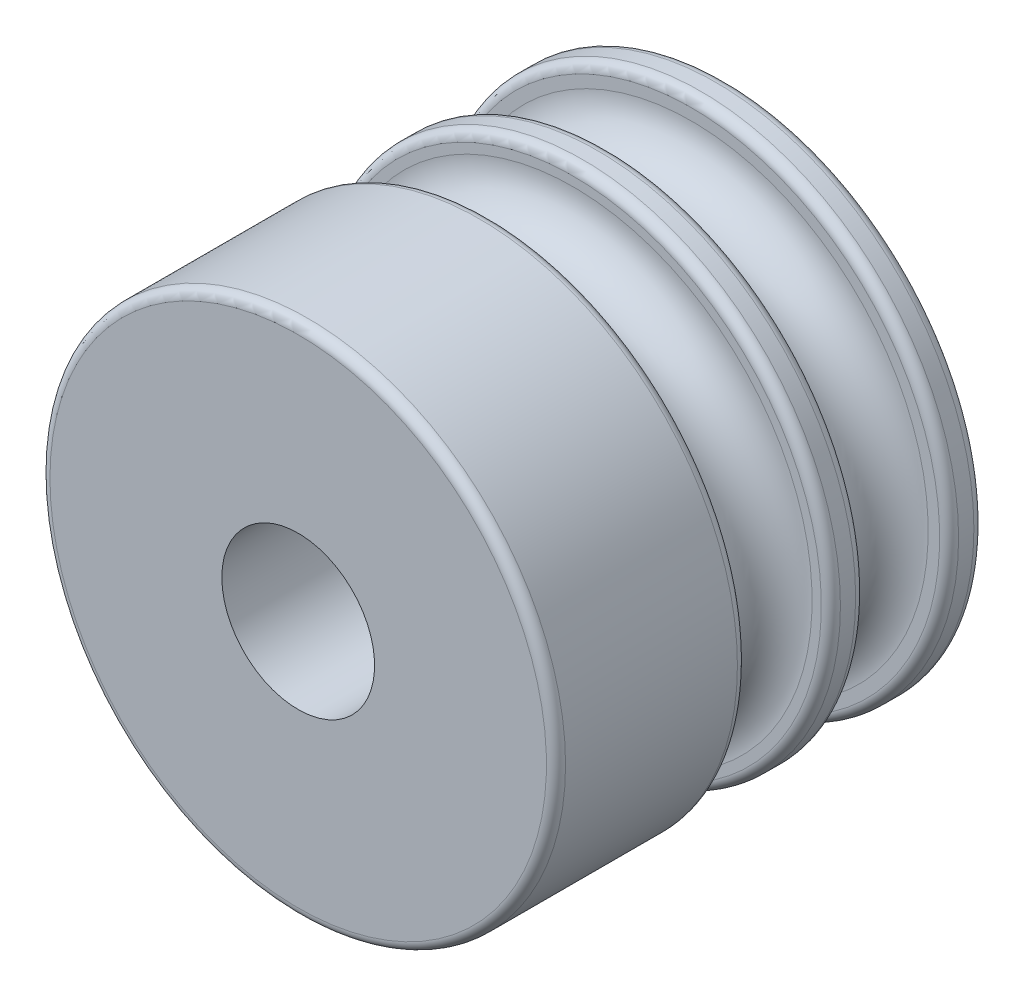
ISO-10303-21;
HEADER;
FILE_DESCRIPTION(('STEP AP214'),'2;1');
FILE_NAME('part.step','',(''),(''),'','','');
FILE_SCHEMA(('AUTOMOTIVE_DESIGN { 1 0 10303 214 1 1 1 1 }'));
ENDSEC;
DATA;
#1=APPLICATION_CONTEXT('core data for automotive mechanical design processes');
#2=APPLICATION_PROTOCOL_DEFINITION('international standard','automotive_design',2000,#1);
#3=PRODUCT_CONTEXT('',#1,'mechanical');
#4=PRODUCT('Part','Part','',(#3));
#5=PRODUCT_RELATED_PRODUCT_CATEGORY('part','',(#4));
#6=PRODUCT_DEFINITION_FORMATION('','',#4);
#7=PRODUCT_DEFINITION_CONTEXT('part definition',#1,'design');
#8=PRODUCT_DEFINITION('design','',#6,#7);
#9=PRODUCT_DEFINITION_SHAPE('','',#8);
#10=(LENGTH_UNIT() NAMED_UNIT(*) SI_UNIT(.MILLI.,.METRE.));
#11=(NAMED_UNIT(*) PLANE_ANGLE_UNIT() SI_UNIT($,.RADIAN.));
#12=(NAMED_UNIT(*) SI_UNIT($,.STERADIAN.) SOLID_ANGLE_UNIT());
#13=UNCERTAINTY_MEASURE_WITH_UNIT(LENGTH_MEASURE(1.E-05),#10,'distance_accuracy_value','');
#14=(GEOMETRIC_REPRESENTATION_CONTEXT(3) GLOBAL_UNCERTAINTY_ASSIGNED_CONTEXT((#13)) GLOBAL_UNIT_ASSIGNED_CONTEXT((#10,
#11,#12)) REPRESENTATION_CONTEXT('',''));
#15=CARTESIAN_POINT('',(0.,0.,0.));
#16=DIRECTION('',(0.,0.,1.));
#17=DIRECTION('',(1.,0.,0.));
#18=AXIS2_PLACEMENT_3D('',#15,#16,#17);
#19=CARTESIAN_POINT('',(-56.5563014577714,0.,-14.6506404312074));
#20=DIRECTION('',(0.,0.,-1.));
#21=DIRECTION('',(-1.,0.,0.));
#22=AXIS2_PLACEMENT_3D('',#19,#20,#21);
#23=TOROIDAL_SURFACE('',#22,12.4003010713163,2.2);
#24=CARTESIAN_POINT('',(-56.5563014577714,0.,-16.8475472081048));
#25=DIRECTION('',(0.,0.,-1.));
#26=DIRECTION('',(-1.,0.,0.));
#27=AXIS2_PLACEMENT_3D('',#24,#25,#26);
#28=CIRCLE('',#27,12.5169227400667);
#29=CARTESIAN_POINT('',(-69.0732241978381,0.,-16.8475472081048));
#30=VERTEX_POINT('',#29);
#31=EDGE_CURVE('E10',#30,#30,#28,.T.);
#32=ORIENTED_EDGE('',*,*,#31,.F.);
#33=EDGE_LOOP('',(#32));
#34=FACE_BOUND('',#33,.T.);
#35=CARTESIAN_POINT('',(-56.5563014577714,0.,-12.4531341862328));
#36=DIRECTION('',(0.,0.,-1.));
#37=DIRECTION('',(-1.,0.,0.));
#38=AXIS2_PLACEMENT_3D('',#35,#36,#37);
#39=CIRCLE('',#38,12.5050211901936);
#40=CARTESIAN_POINT('',(-69.0613226479649,0.,-12.4531341862328));
#41=VERTEX_POINT('',#40);
#42=EDGE_CURVE('E85',#41,#41,#39,.T.);
#43=ORIENTED_EDGE('',*,*,#42,.T.);
#44=EDGE_LOOP('',(#43));
#45=FACE_BOUND('',#44,.T.);
#46=ADVANCED_FACE('F27',(#34,#45),#23,.F.);
#47=CARTESIAN_POINT('',(-44.0393787177046,0.,-16.8475472081048));
#48=DIRECTION('',(0.,0.,-1.));
#49=DIRECTION('',(-1.,0.,0.));
#50=AXIS2_PLACEMENT_3D('',#47,#48,#49);
#51=PLANE('',#50);
#52=CARTESIAN_POINT('',(-56.5563014577714,0.,-16.8475472081048));
#53=DIRECTION('',(0.,0.,-1.));
#54=DIRECTION('',(-1.,0.,0.));
#55=AXIS2_PLACEMENT_3D('',#52,#53,#54);
#56=CIRCLE('',#55,13.);
#57=CARTESIAN_POINT('',(-69.5563014577714,0.,-16.8475472081048));
#58=VERTEX_POINT('',#57);
#59=EDGE_CURVE('E33',#58,#58,#56,.T.);
#60=ORIENTED_EDGE('',*,*,#59,.F.);
#61=EDGE_LOOP('',(#60));
#62=FACE_BOUND('',#61,.T.);
#63=ORIENTED_EDGE('',*,*,#31,.T.);
#64=EDGE_LOOP('',(#63));
#65=FACE_BOUND('',#64,.T.);
#66=ADVANCED_FACE('F182',(#62,#65),#51,.F.);
#67=CARTESIAN_POINT('',(-56.5563014577714,0.,-17.3475472081048));
#68=DIRECTION('',(0.,0.,-1.));
#69=DIRECTION('',(-1.,0.,0.));
#70=AXIS2_PLACEMENT_3D('',#67,#68,#69);
#71=TOROIDAL_SURFACE('',#70,13.,0.5);
#72=CARTESIAN_POINT('',(-56.5563014577714,0.,-17.3475472081048));
#73=DIRECTION('',(0.,0.,-1.));
#74=DIRECTION('',(-1.,0.,0.));
#75=AXIS2_PLACEMENT_3D('',#72,#73,#74);
#76=CIRCLE('',#75,13.5);
#77=CARTESIAN_POINT('',(-70.0563014577714,0.,-17.3475472081048));
#78=VERTEX_POINT('',#77);
#79=EDGE_CURVE('E37',#78,#78,#76,.T.);
#80=ORIENTED_EDGE('',*,*,#79,.F.);
#81=EDGE_LOOP('',(#80));
#82=FACE_BOUND('',#81,.T.);
#83=ORIENTED_EDGE('',*,*,#59,.T.);
#84=EDGE_LOOP('',(#83));
#85=FACE_BOUND('',#84,.T.);
#86=ADVANCED_FACE('F177',(#82,#85),#71,.T.);
#87=CARTESIAN_POINT('',(-56.5563014577714,0.,-55.2783424319312));
#88=DIRECTION('',(0.,0.,-1.));
#89=DIRECTION('',(-1.,0.,0.));
#90=AXIS2_PLACEMENT_3D('',#87,#88,#89);
#91=CYLINDRICAL_SURFACE('',#90,13.5);
#92=CARTESIAN_POINT('',(-56.5563014577714,0.,-18.1437652868408));
#93=DIRECTION('',(0.,0.,-1.));
#94=DIRECTION('',(-1.,0.,0.));
#95=AXIS2_PLACEMENT_3D('',#92,#93,#94);
#96=CIRCLE('',#95,13.5);
#97=CARTESIAN_POINT('',(-70.0563014577714,0.,-18.1437652868408));
#98=VERTEX_POINT('',#97);
#99=EDGE_CURVE('E41',#98,#98,#96,.T.);
#100=ORIENTED_EDGE('',*,*,#99,.F.);
#101=EDGE_LOOP('',(#100));
#102=FACE_BOUND('',#101,.T.);
#103=ORIENTED_EDGE('',*,*,#79,.T.);
#104=EDGE_LOOP('',(#103));
#105=FACE_BOUND('',#104,.T.);
#106=ADVANCED_FACE('F171',(#102,#105),#91,.T.);
#107=CARTESIAN_POINT('',(-56.5563014577714,0.,-18.1437652868408));
#108=DIRECTION('',(0.,0.,-1.));
#109=DIRECTION('',(-1.,0.,0.));
#110=AXIS2_PLACEMENT_3D('',#107,#108,#109);
#111=TOROIDAL_SURFACE('',#110,13.,0.5);
#112=CARTESIAN_POINT('',(-56.5563014577714,0.,-18.6437652868408));
#113=DIRECTION('',(0.,0.,-1.));
#114=DIRECTION('',(-1.,0.,0.));
#115=AXIS2_PLACEMENT_3D('',#112,#113,#114);
#116=CIRCLE('',#115,13.);
#117=CARTESIAN_POINT('',(-69.5563014577714,0.,-18.6437652868408));
#118=VERTEX_POINT('',#117);
#119=EDGE_CURVE('E46',#118,#118,#116,.T.);
#120=ORIENTED_EDGE('',*,*,#119,.F.);
#121=EDGE_LOOP('',(#120));
#122=FACE_BOUND('',#121,.T.);
#123=ORIENTED_EDGE('',*,*,#99,.T.);
#124=EDGE_LOOP('',(#123));
#125=FACE_BOUND('',#124,.T.);
#126=ADVANCED_FACE('F165',(#122,#125),#111,.T.);
#127=CARTESIAN_POINT('',(-44.156000386455,0.,-18.6437652868408));
#128=DIRECTION('',(0.,0.,1.));
#129=DIRECTION('',(1.,0.,0.));
#130=AXIS2_PLACEMENT_3D('',#127,#128,#129);
#131=PLANE('',#130);
#132=CARTESIAN_POINT('',(-56.5563014577714,0.,-18.6437652868408));
#133=DIRECTION('',(0.,0.,-1.));
#134=DIRECTION('',(-1.,0.,0.));
#135=AXIS2_PLACEMENT_3D('',#132,#133,#134);
#136=CIRCLE('',#135,12.4003010713163);
#137=CARTESIAN_POINT('',(-68.9566025290877,0.,-18.6437652868408));
#138=VERTEX_POINT('',#137);
#139=EDGE_CURVE('E49',#138,#138,#136,.T.);
#140=ORIENTED_EDGE('',*,*,#139,.F.);
#141=EDGE_LOOP('',(#140));
#142=FACE_BOUND('',#141,.T.);
#143=ORIENTED_EDGE('',*,*,#119,.T.);
#144=EDGE_LOOP('',(#143));
#145=FACE_BOUND('',#144,.T.);
#146=ADVANCED_FACE('F159',(#142,#145),#131,.F.);
#147=CARTESIAN_POINT('',(-56.5563014577714,0.,-20.8437652868408));
#148=DIRECTION('',(0.,0.,-1.));
#149=DIRECTION('',(-1.,0.,0.));
#150=AXIS2_PLACEMENT_3D('',#147,#148,#149);
#151=TOROIDAL_SURFACE('',#150,12.4003010713164,2.2);
#152=CARTESIAN_POINT('',(-56.5563014577714,0.,-23.0437652868408));
#153=DIRECTION('',(0.,0.,-1.));
#154=DIRECTION('',(-1.,0.,0.));
#155=AXIS2_PLACEMENT_3D('',#152,#153,#154);
#156=CIRCLE('',#155,12.4003010713163);
#157=CARTESIAN_POINT('',(-68.9566025290877,0.,-23.0437652868408));
#158=VERTEX_POINT('',#157);
#159=EDGE_CURVE('E52',#158,#158,#156,.T.);
#160=ORIENTED_EDGE('',*,*,#159,.F.);
#161=EDGE_LOOP('',(#160));
#162=FACE_BOUND('',#161,.T.);
#163=ORIENTED_EDGE('',*,*,#139,.T.);
#164=EDGE_LOOP('',(#163));
#165=FACE_BOUND('',#164,.T.);
#166=ADVANCED_FACE('F153',(#162,#165),#151,.F.);
#167=CARTESIAN_POINT('',(-43.5562338448639,0.,-23.0437652868408));
#168=DIRECTION('',(0.,0.,-1.));
#169=DIRECTION('',(-1.,0.,0.));
#170=AXIS2_PLACEMENT_3D('',#167,#168,#169);
#171=PLANE('',#170);
#172=CARTESIAN_POINT('',(-56.5563014577714,0.,-23.0437652868408));
#173=DIRECTION('',(0.,0.,-1.));
#174=DIRECTION('',(-1.,0.,0.));
#175=AXIS2_PLACEMENT_3D('',#172,#173,#174);
#176=CIRCLE('',#175,13.0000676129075);
#177=CARTESIAN_POINT('',(-69.5563690706789,0.,-23.0437652868408));
#178=VERTEX_POINT('',#177);
#179=EDGE_CURVE('E55',#178,#178,#176,.T.);
#180=ORIENTED_EDGE('',*,*,#179,.F.);
#181=EDGE_LOOP('',(#180));
#182=FACE_BOUND('',#181,.T.);
#183=ORIENTED_EDGE('',*,*,#159,.T.);
#184=EDGE_LOOP('',(#183));
#185=FACE_BOUND('',#184,.T.);
#186=ADVANCED_FACE('F147',(#182,#185),#171,.F.);
#187=CARTESIAN_POINT('',(-56.5563014577714,0.,-23.5437652868408));
#188=DIRECTION('',(0.,0.,-1.));
#189=DIRECTION('',(-1.,0.,0.));
#190=AXIS2_PLACEMENT_3D('',#187,#188,#189);
#191=TOROIDAL_SURFACE('',#190,13.0000676129075,0.500000000000001);
#192=CARTESIAN_POINT('',(-56.5563014577714,0.,-23.5355428580031));
#193=DIRECTION('',(0.,0.,-1.));
#194=DIRECTION('',(-1.,0.,0.));
#195=AXIS2_PLACEMENT_3D('',#192,#193,#194);
#196=CIRCLE('',#195,13.5);
#197=CARTESIAN_POINT('',(-70.0563014577714,0.,-23.5355428580031));
#198=VERTEX_POINT('',#197);
#199=EDGE_CURVE('E58',#198,#198,#196,.T.);
#200=ORIENTED_EDGE('',*,*,#199,.F.);
#201=EDGE_LOOP('',(#200));
#202=FACE_BOUND('',#201,.T.);
#203=ORIENTED_EDGE('',*,*,#179,.T.);
#204=EDGE_LOOP('',(#203));
#205=FACE_BOUND('',#204,.T.);
#206=ADVANCED_FACE('F141',(#202,#205),#191,.T.);
#207=CARTESIAN_POINT('',(-56.5563014577714,0.,-55.2783424319312));
#208=DIRECTION('',(0.,0.,-1.));
#209=DIRECTION('',(-1.,0.,0.));
#210=AXIS2_PLACEMENT_3D('',#207,#208,#209);
#211=CYLINDRICAL_SURFACE('',#210,13.5);
#212=CARTESIAN_POINT('',(-56.5563014577714,0.,-24.3355428580031));
#213=DIRECTION('',(0.,0.,-1.));
#214=DIRECTION('',(-1.,0.,0.));
#215=AXIS2_PLACEMENT_3D('',#212,#213,#214);
#216=CIRCLE('',#215,13.5);
#217=CARTESIAN_POINT('',(-70.0563014577714,0.,-24.3355428580031));
#218=VERTEX_POINT('',#217);
#219=EDGE_CURVE('E61',#218,#218,#216,.T.);
#220=ORIENTED_EDGE('',*,*,#219,.F.);
#221=EDGE_LOOP('',(#220));
#222=FACE_BOUND('',#221,.T.);
#223=ORIENTED_EDGE('',*,*,#199,.T.);
#224=EDGE_LOOP('',(#223));
#225=FACE_BOUND('',#224,.T.);
#226=ADVANCED_FACE('F135',(#222,#225),#211,.T.);
#227=CARTESIAN_POINT('',(-56.5563014577714,0.,-24.3437652868408));
#228=DIRECTION('',(0.,0.,-1.));
#229=DIRECTION('',(-1.,0.,0.));
#230=AXIS2_PLACEMENT_3D('',#227,#228,#229);
#231=TOROIDAL_SURFACE('',#230,13.0000676129075,0.500000000000001);
#232=CARTESIAN_POINT('',(-56.5563014577714,0.,-24.8437652868408));
#233=DIRECTION('',(0.,0.,-1.));
#234=DIRECTION('',(-1.,0.,0.));
#235=AXIS2_PLACEMENT_3D('',#232,#233,#234);
#236=CIRCLE('',#235,13.0000676129075);
#237=CARTESIAN_POINT('',(-69.5563690706789,0.,-24.8437652868408));
#238=VERTEX_POINT('',#237);
#239=EDGE_CURVE('E64',#238,#238,#236,.T.);
#240=ORIENTED_EDGE('',*,*,#239,.F.);
#241=EDGE_LOOP('',(#240));
#242=FACE_BOUND('',#241,.T.);
#243=ORIENTED_EDGE('',*,*,#219,.T.);
#244=EDGE_LOOP('',(#243));
#245=FACE_BOUND('',#244,.T.);
#246=ADVANCED_FACE('F129',(#242,#245),#231,.T.);
#247=CARTESIAN_POINT('',(-45.8533577326191,0.,-24.8437652868408));
#248=DIRECTION('',(0.,0.,1.));
#249=DIRECTION('',(1.,0.,0.));
#250=AXIS2_PLACEMENT_3D('',#247,#248,#249);
#251=PLANE('',#250);
#252=CARTESIAN_POINT('',(-56.5563014577714,0.,-24.8437652868408));
#253=DIRECTION('',(0.,0.,-1.));
#254=DIRECTION('',(-1.,0.,0.));
#255=AXIS2_PLACEMENT_3D('',#252,#253,#254);
#256=CIRCLE('',#255,3.99999999999999);
#257=CARTESIAN_POINT('',(-60.5563014577714,0.,-24.8437652868408));
#258=VERTEX_POINT('',#257);
#259=EDGE_CURVE('E67',#258,#258,#256,.T.);
#260=ORIENTED_EDGE('',*,*,#259,.F.);
#261=EDGE_LOOP('',(#260));
#262=FACE_BOUND('',#261,.T.);
#263=ORIENTED_EDGE('',*,*,#239,.T.);
#264=EDGE_LOOP('',(#263));
#265=FACE_BOUND('',#264,.T.);
#266=ADVANCED_FACE('F123',(#262,#265),#251,.F.);
#267=CARTESIAN_POINT('',(-56.5563014577714,0.,-55.2783424319312));
#268=DIRECTION('',(0.,0.,-1.));
#269=DIRECTION('',(-1.,0.,0.));
#270=AXIS2_PLACEMENT_3D('',#267,#268,#269);
#271=CYLINDRICAL_SURFACE('',#270,3.99999999999999);
#272=CARTESIAN_POINT('',(-56.5563014577714,0.,-2.4531341862328));
#273=DIRECTION('',(0.,0.,-1.));
#274=DIRECTION('',(-1.,0.,0.));
#275=AXIS2_PLACEMENT_3D('',#272,#273,#274);
#276=CIRCLE('',#275,3.99999999999999);
#277=CARTESIAN_POINT('',(-60.5563014577713,0.,-2.4531341862328));
#278=VERTEX_POINT('',#277);
#279=EDGE_CURVE('E70',#278,#278,#276,.T.);
#280=ORIENTED_EDGE('',*,*,#279,.F.);
#281=EDGE_LOOP('',(#280));
#282=FACE_BOUND('',#281,.T.);
#283=ORIENTED_EDGE('',*,*,#259,.T.);
#284=EDGE_LOOP('',(#283));
#285=FACE_BOUND('',#284,.T.);
#286=ADVANCED_FACE('F117',(#282,#285),#271,.F.);
#287=CARTESIAN_POINT('',(-43.5563014577714,0.,-2.4531341862328));
#288=DIRECTION('',(0.,0.,-1.));
#289=DIRECTION('',(-1.,0.,0.));
#290=AXIS2_PLACEMENT_3D('',#287,#288,#289);
#291=PLANE('',#290);
#292=CARTESIAN_POINT('',(-56.5563014577714,0.,-2.4531341862328));
#293=DIRECTION('',(0.,0.,-1.));
#294=DIRECTION('',(-1.,0.,0.));
#295=AXIS2_PLACEMENT_3D('',#292,#293,#294);
#296=CIRCLE('',#295,13.);
#297=CARTESIAN_POINT('',(-69.5563014577714,0.,-2.45313418623279));
#298=VERTEX_POINT('',#297);
#299=EDGE_CURVE('E73',#298,#298,#296,.T.);
#300=ORIENTED_EDGE('',*,*,#299,.F.);
#301=EDGE_LOOP('',(#300));
#302=FACE_BOUND('',#301,.T.);
#303=ORIENTED_EDGE('',*,*,#279,.T.);
#304=EDGE_LOOP('',(#303));
#305=FACE_BOUND('',#304,.T.);
#306=ADVANCED_FACE('F111',(#302,#305),#291,.F.);
#307=CARTESIAN_POINT('',(-56.5563014577714,0.,-2.9531341862328));
#308=DIRECTION('',(0.,0.,-1.));
#309=DIRECTION('',(-1.,0.,0.));
#310=AXIS2_PLACEMENT_3D('',#307,#308,#309);
#311=TOROIDAL_SURFACE('',#310,13.,0.500000000000003);
#312=CARTESIAN_POINT('',(-56.5563014577714,0.,-2.9531341862328));
#313=DIRECTION('',(0.,0.,-1.));
#314=DIRECTION('',(-1.,0.,0.));
#315=AXIS2_PLACEMENT_3D('',#312,#313,#314);
#316=CIRCLE('',#315,13.5);
#317=CARTESIAN_POINT('',(-70.0563014577714,0.,-2.9531341862328));
#318=VERTEX_POINT('',#317);
#319=EDGE_CURVE('E76',#318,#318,#316,.T.);
#320=ORIENTED_EDGE('',*,*,#319,.F.);
#321=EDGE_LOOP('',(#320));
#322=FACE_BOUND('',#321,.T.);
#323=ORIENTED_EDGE('',*,*,#299,.T.);
#324=EDGE_LOOP('',(#323));
#325=FACE_BOUND('',#324,.T.);
#326=ADVANCED_FACE('F105',(#322,#325),#311,.T.);
#327=CARTESIAN_POINT('',(-56.5563014577714,0.,-55.2783424319312));
#328=DIRECTION('',(0.,0.,-1.));
#329=DIRECTION('',(-1.,0.,0.));
#330=AXIS2_PLACEMENT_3D('',#327,#328,#329);
#331=CYLINDRICAL_SURFACE('',#330,13.5);
#332=CARTESIAN_POINT('',(-56.5563014577714,0.,-11.9531341862328));
#333=DIRECTION('',(0.,0.,-1.));
#334=DIRECTION('',(-1.,0.,0.));
#335=AXIS2_PLACEMENT_3D('',#332,#333,#334);
#336=CIRCLE('',#335,13.5);
#337=CARTESIAN_POINT('',(-70.0563014577714,0.,-11.9531341862328));
#338=VERTEX_POINT('',#337);
#339=EDGE_CURVE('E79',#338,#338,#336,.T.);
#340=ORIENTED_EDGE('',*,*,#339,.F.);
#341=EDGE_LOOP('',(#340));
#342=FACE_BOUND('',#341,.T.);
#343=ORIENTED_EDGE('',*,*,#319,.T.);
#344=EDGE_LOOP('',(#343));
#345=FACE_BOUND('',#344,.T.);
#346=ADVANCED_FACE('F99',(#342,#345),#331,.T.);
#347=CARTESIAN_POINT('',(-56.5563014577714,0.,-11.9531341862328));
#348=DIRECTION('',(0.,0.,-1.));
#349=DIRECTION('',(-1.,0.,0.));
#350=AXIS2_PLACEMENT_3D('',#347,#348,#349);
#351=TOROIDAL_SURFACE('',#350,13.,0.500000000000005);
#352=CARTESIAN_POINT('',(-56.5563014577714,0.,-12.4531341862328));
#353=DIRECTION('',(0.,0.,-1.));
#354=DIRECTION('',(-1.,0.,0.));
#355=AXIS2_PLACEMENT_3D('',#352,#353,#354);
#356=CIRCLE('',#355,13.);
#357=CARTESIAN_POINT('',(-69.5563014577714,0.,-12.4531341862328));
#358=VERTEX_POINT('',#357);
#359=EDGE_CURVE('E82',#358,#358,#356,.T.);
#360=ORIENTED_EDGE('',*,*,#359,.F.);
#361=EDGE_LOOP('',(#360));
#362=FACE_BOUND('',#361,.T.);
#363=ORIENTED_EDGE('',*,*,#339,.T.);
#364=EDGE_LOOP('',(#363));
#365=FACE_BOUND('',#364,.T.);
#366=ADVANCED_FACE('F93',(#362,#365),#351,.T.);
#367=CARTESIAN_POINT('',(-44.0512802675778,0.,-12.4531341862328));
#368=DIRECTION('',(0.,0.,1.));
#369=DIRECTION('',(1.,0.,0.));
#370=AXIS2_PLACEMENT_3D('',#367,#368,#369);
#371=PLANE('',#370);
#372=ORIENTED_EDGE('',*,*,#42,.F.);
#373=EDGE_LOOP('',(#372));
#374=FACE_BOUND('',#373,.T.);
#375=ORIENTED_EDGE('',*,*,#359,.T.);
#376=EDGE_LOOP('',(#375));
#377=FACE_BOUND('',#376,.T.);
#378=ADVANCED_FACE('F90',(#374,#377),#371,.F.);
#379=CLOSED_SHELL('',(#46,#66,#86,#106,#126,#146,#166,#186,#206,#226,#246,#266,#286,#306,#326,
#346,#366,#378));
#380=MANIFOLD_SOLID_BREP('B2',#379);
#381=ADVANCED_BREP_SHAPE_REPRESENTATION('',(#18,#380),#14);
#382=SHAPE_DEFINITION_REPRESENTATION(#9,#381);
ENDSEC;
END-ISO-10303-21;
